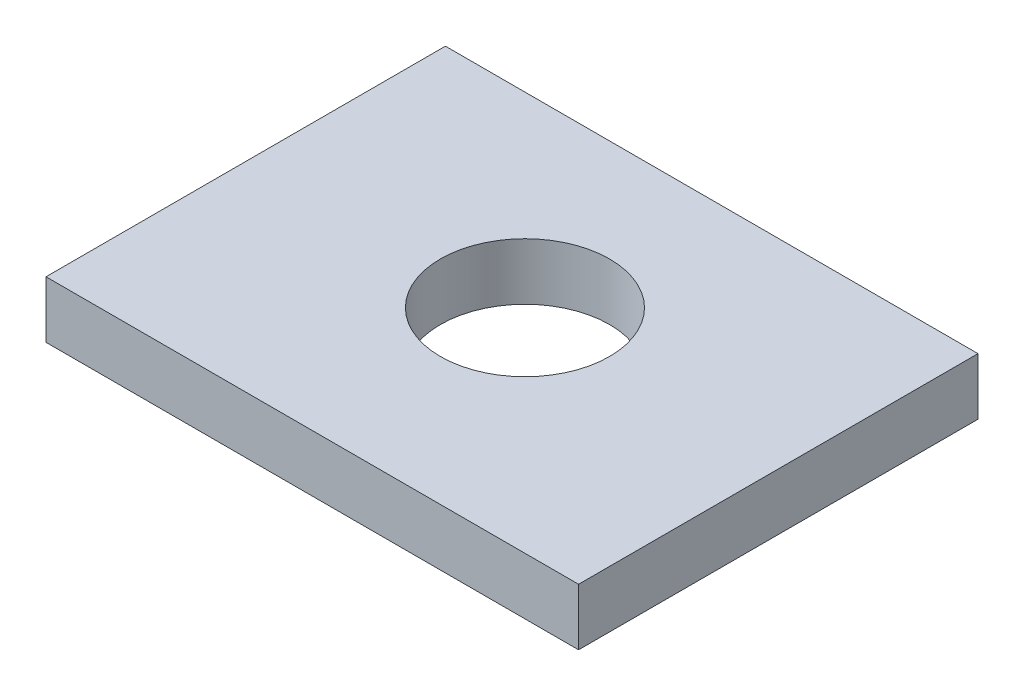
ISO-10303-21;
HEADER;
FILE_DESCRIPTION(('STEP AP214'),'2;1');
FILE_NAME('part.step','',(''),(''),'','','');
FILE_SCHEMA(('AUTOMOTIVE_DESIGN { 1 0 10303 214 1 1 1 1 }'));
ENDSEC;
DATA;
#1=APPLICATION_CONTEXT('core data for automotive mechanical design processes');
#2=APPLICATION_PROTOCOL_DEFINITION('international standard','automotive_design',2000,#1);
#3=PRODUCT_CONTEXT('',#1,'mechanical');
#4=PRODUCT('Part','Part','',(#3));
#5=PRODUCT_RELATED_PRODUCT_CATEGORY('part','',(#4));
#6=PRODUCT_DEFINITION_FORMATION('','',#4);
#7=PRODUCT_DEFINITION_CONTEXT('part definition',#1,'design');
#8=PRODUCT_DEFINITION('design','',#6,#7);
#9=PRODUCT_DEFINITION_SHAPE('','',#8);
#10=(LENGTH_UNIT() NAMED_UNIT(*) SI_UNIT(.MILLI.,.METRE.));
#11=(NAMED_UNIT(*) PLANE_ANGLE_UNIT() SI_UNIT($,.RADIAN.));
#12=(NAMED_UNIT(*) SI_UNIT($,.STERADIAN.) SOLID_ANGLE_UNIT());
#13=UNCERTAINTY_MEASURE_WITH_UNIT(LENGTH_MEASURE(1.E-05),#10,'distance_accuracy_value','');
#14=(GEOMETRIC_REPRESENTATION_CONTEXT(3) GLOBAL_UNCERTAINTY_ASSIGNED_CONTEXT((#13)) GLOBAL_UNIT_ASSIGNED_CONTEXT((#10,
#11,#12)) REPRESENTATION_CONTEXT('',''));
#15=CARTESIAN_POINT('',(0.,0.,0.));
#16=DIRECTION('',(0.,0.,1.));
#17=DIRECTION('',(1.,0.,0.));
#18=AXIS2_PLACEMENT_3D('',#15,#16,#17);
#19=CARTESIAN_POINT('',(0.,96.6,0.));
#20=DIRECTION('',(0.,1.,0.));
#21=DIRECTION('',(0.,0.,1.));
#22=AXIS2_PLACEMENT_3D('',#19,#20,#21);
#23=PLANE('',#22);
#24=DIRECTION('',(0.,0.,1.));
#25=VECTOR('',#24,1.);
#26=CARTESIAN_POINT('',(-15.,96.6,348.489999694));
#27=LINE('',#26,#25);
#28=CARTESIAN_POINT('',(-15.,96.6,348.489999694));
#29=VERTEX_POINT('',#28);
#30=CARTESIAN_POINT('',(-15.,96.6,370.989999694));
#31=VERTEX_POINT('',#30);
#32=EDGE_CURVE('E85',#29,#31,#27,.T.);
#33=ORIENTED_EDGE('',*,*,#32,.T.);
#34=DIRECTION('',(1.,0.,0.));
#35=VECTOR('',#34,1.);
#36=CARTESIAN_POINT('',(-15.,96.6,370.989999694));
#37=LINE('',#36,#35);
#38=CARTESIAN_POINT('',(15.,96.6,370.989999694));
#39=VERTEX_POINT('',#38);
#40=EDGE_CURVE('E80',#31,#39,#37,.T.);
#41=ORIENTED_EDGE('',*,*,#40,.T.);
#42=DIRECTION('',(0.,0.,-1.));
#43=VECTOR('',#42,1.);
#44=CARTESIAN_POINT('',(15.,96.6,370.989999694));
#45=LINE('',#44,#43);
#46=CARTESIAN_POINT('',(15.,96.6,348.489999694));
#47=VERTEX_POINT('',#46);
#48=EDGE_CURVE('E83',#39,#47,#45,.T.);
#49=ORIENTED_EDGE('',*,*,#48,.T.);
#50=DIRECTION('',(-1.,0.,0.));
#51=VECTOR('',#50,1.);
#52=CARTESIAN_POINT('',(15.,96.6,348.489999694));
#53=LINE('',#52,#51);
#54=EDGE_CURVE('E50',#47,#29,#53,.T.);
#55=ORIENTED_EDGE('',*,*,#54,.T.);
#56=EDGE_LOOP('',(#33,#41,#49,#55));
#57=FACE_BOUND('',#56,.T.);
#58=CARTESIAN_POINT('',(0.,96.6,359.009999694));
#59=DIRECTION('',(0.,1.,0.));
#60=DIRECTION('',(0.,0.,1.));
#61=AXIS2_PLACEMENT_3D('',#58,#59,#60);
#62=CIRCLE('',#61,4.7625);
#63=CARTESIAN_POINT('',(0.,96.6,363.772499694));
#64=VERTEX_POINT('',#63);
#65=EDGE_CURVE('E100',#64,#64,#62,.T.);
#66=ORIENTED_EDGE('',*,*,#65,.F.);
#67=EDGE_LOOP('',(#66));
#68=FACE_BOUND('',#67,.T.);
#69=ADVANCED_FACE('F33',(#57,#68),#23,.T.);
#70=CARTESIAN_POINT('',(0.,93.4,0.));
#71=DIRECTION('',(0.,1.,0.));
#72=DIRECTION('',(0.,0.,1.));
#73=AXIS2_PLACEMENT_3D('',#70,#71,#72);
#74=PLANE('',#73);
#75=DIRECTION('',(0.,0.,1.));
#76=VECTOR('',#75,1.);
#77=CARTESIAN_POINT('',(-15.,93.4,348.489999694));
#78=LINE('',#77,#76);
#79=CARTESIAN_POINT('',(-15.,93.4,348.489999694));
#80=VERTEX_POINT('',#79);
#81=CARTESIAN_POINT('',(-15.,93.4,370.989999694));
#82=VERTEX_POINT('',#81);
#83=EDGE_CURVE('E97',#80,#82,#78,.T.);
#84=ORIENTED_EDGE('',*,*,#83,.F.);
#85=DIRECTION('',(-1.,0.,0.));
#86=VECTOR('',#85,1.);
#87=CARTESIAN_POINT('',(15.,93.4,348.489999694));
#88=LINE('',#87,#86);
#89=CARTESIAN_POINT('',(15.,93.4,348.489999694));
#90=VERTEX_POINT('',#89);
#91=EDGE_CURVE('E73',#90,#80,#88,.T.);
#92=ORIENTED_EDGE('',*,*,#91,.F.);
#93=DIRECTION('',(0.,0.,-1.));
#94=VECTOR('',#93,1.);
#95=CARTESIAN_POINT('',(15.,93.4,370.989999694));
#96=LINE('',#95,#94);
#97=CARTESIAN_POINT('',(15.,93.4,370.989999694));
#98=VERTEX_POINT('',#97);
#99=EDGE_CURVE('E67',#98,#90,#96,.T.);
#100=ORIENTED_EDGE('',*,*,#99,.F.);
#101=DIRECTION('',(1.,0.,0.));
#102=VECTOR('',#101,1.);
#103=CARTESIAN_POINT('',(-15.,93.4,370.989999694));
#104=LINE('',#103,#102);
#105=EDGE_CURVE('E89',#82,#98,#104,.T.);
#106=ORIENTED_EDGE('',*,*,#105,.F.);
#107=EDGE_LOOP('',(#84,#92,#100,#106));
#108=FACE_BOUND('',#107,.T.);
#109=CARTESIAN_POINT('',(0.,93.4,359.009999694));
#110=DIRECTION('',(0.,1.,0.));
#111=DIRECTION('',(0.,0.,1.));
#112=AXIS2_PLACEMENT_3D('',#109,#110,#111);
#113=CIRCLE('',#112,4.7625);
#114=CARTESIAN_POINT('',(0.,93.4,363.772499694));
#115=VERTEX_POINT('',#114);
#116=EDGE_CURVE('E112',#115,#115,#113,.T.);
#117=ORIENTED_EDGE('',*,*,#116,.T.);
#118=EDGE_LOOP('',(#117));
#119=FACE_BOUND('',#118,.T.);
#120=ADVANCED_FACE('F108',(#108,#119),#74,.F.);
#121=CARTESIAN_POINT('',(-15.,96.6,348.489999694));
#122=DIRECTION('',(1.,0.,0.));
#123=DIRECTION('',(0.,0.,-1.));
#124=AXIS2_PLACEMENT_3D('',#121,#122,#123);
#125=PLANE('',#124);
#126=ORIENTED_EDGE('',*,*,#83,.T.);
#127=DIRECTION('',(0.,-1.,0.));
#128=VECTOR('',#127,1.);
#129=CARTESIAN_POINT('',(-15.,96.6,370.989999694));
#130=LINE('',#129,#128);
#131=EDGE_CURVE('E11',#31,#82,#130,.T.);
#132=ORIENTED_EDGE('',*,*,#131,.F.);
#133=ORIENTED_EDGE('',*,*,#32,.F.);
#134=DIRECTION('',(0.,-1.,0.));
#135=VECTOR('',#134,1.);
#136=CARTESIAN_POINT('',(-15.,96.6,348.489999694));
#137=LINE('',#136,#135);
#138=EDGE_CURVE('E93',#29,#80,#137,.T.);
#139=ORIENTED_EDGE('',*,*,#138,.T.);
#140=EDGE_LOOP('',(#126,#132,#133,#139));
#141=FACE_BOUND('',#140,.T.);
#142=ADVANCED_FACE('F35',(#141),#125,.F.);
#143=CARTESIAN_POINT('',(-15.,96.6,370.989999694));
#144=DIRECTION('',(0.,0.,-1.));
#145=DIRECTION('',(-1.,0.,0.));
#146=AXIS2_PLACEMENT_3D('',#143,#144,#145);
#147=PLANE('',#146);
#148=ORIENTED_EDGE('',*,*,#105,.T.);
#149=DIRECTION('',(0.,-1.,0.));
#150=VECTOR('',#149,1.);
#151=CARTESIAN_POINT('',(15.,96.6,370.989999694));
#152=LINE('',#151,#150);
#153=EDGE_CURVE('E42',#39,#98,#152,.T.);
#154=ORIENTED_EDGE('',*,*,#153,.F.);
#155=ORIENTED_EDGE('',*,*,#40,.F.);
#156=ORIENTED_EDGE('',*,*,#131,.T.);
#157=EDGE_LOOP('',(#148,#154,#155,#156));
#158=FACE_BOUND('',#157,.T.);
#159=ADVANCED_FACE('F88',(#158),#147,.F.);
#160=CARTESIAN_POINT('',(15.,96.6,370.989999694));
#161=DIRECTION('',(-1.,0.,0.));
#162=DIRECTION('',(0.,0.,1.));
#163=AXIS2_PLACEMENT_3D('',#160,#161,#162);
#164=PLANE('',#163);
#165=ORIENTED_EDGE('',*,*,#99,.T.);
#166=DIRECTION('',(0.,-1.,0.));
#167=VECTOR('',#166,1.);
#168=CARTESIAN_POINT('',(15.,96.6,348.489999694));
#169=LINE('',#168,#167);
#170=EDGE_CURVE('E90',#47,#90,#169,.T.);
#171=ORIENTED_EDGE('',*,*,#170,.F.);
#172=ORIENTED_EDGE('',*,*,#48,.F.);
#173=ORIENTED_EDGE('',*,*,#153,.T.);
#174=EDGE_LOOP('',(#165,#171,#172,#173));
#175=FACE_BOUND('',#174,.T.);
#176=ADVANCED_FACE('F91',(#175),#164,.F.);
#177=CARTESIAN_POINT('',(15.,96.6,348.489999694));
#178=DIRECTION('',(0.,0.,1.));
#179=DIRECTION('',(1.,0.,0.));
#180=AXIS2_PLACEMENT_3D('',#177,#178,#179);
#181=PLANE('',#180);
#182=ORIENTED_EDGE('',*,*,#91,.T.);
#183=ORIENTED_EDGE('',*,*,#138,.F.);
#184=ORIENTED_EDGE('',*,*,#54,.F.);
#185=ORIENTED_EDGE('',*,*,#170,.T.);
#186=EDGE_LOOP('',(#182,#183,#184,#185));
#187=FACE_BOUND('',#186,.T.);
#188=ADVANCED_FACE('F105',(#187),#181,.F.);
#189=CARTESIAN_POINT('',(0.,96.6,359.009999694));
#190=DIRECTION('',(0.,-1.,0.));
#191=DIRECTION('',(0.,0.,-1.));
#192=AXIS2_PLACEMENT_3D('',#189,#190,#191);
#193=CYLINDRICAL_SURFACE('',#192,4.7625);
#194=ORIENTED_EDGE('',*,*,#65,.T.);
#195=EDGE_LOOP('',(#194));
#196=FACE_BOUND('',#195,.T.);
#197=ORIENTED_EDGE('',*,*,#116,.F.);
#198=EDGE_LOOP('',(#197));
#199=FACE_BOUND('',#198,.T.);
#200=ADVANCED_FACE('F118',(#196,#199),#193,.F.);
#201=CLOSED_SHELL('',(#69,#120,#142,#159,#176,#188,#200));
#202=MANIFOLD_SOLID_BREP('B2',#201);
#203=ADVANCED_BREP_SHAPE_REPRESENTATION('',(#18,#202),#14);
#204=SHAPE_DEFINITION_REPRESENTATION(#9,#203);
ENDSEC;
END-ISO-10303-21;
